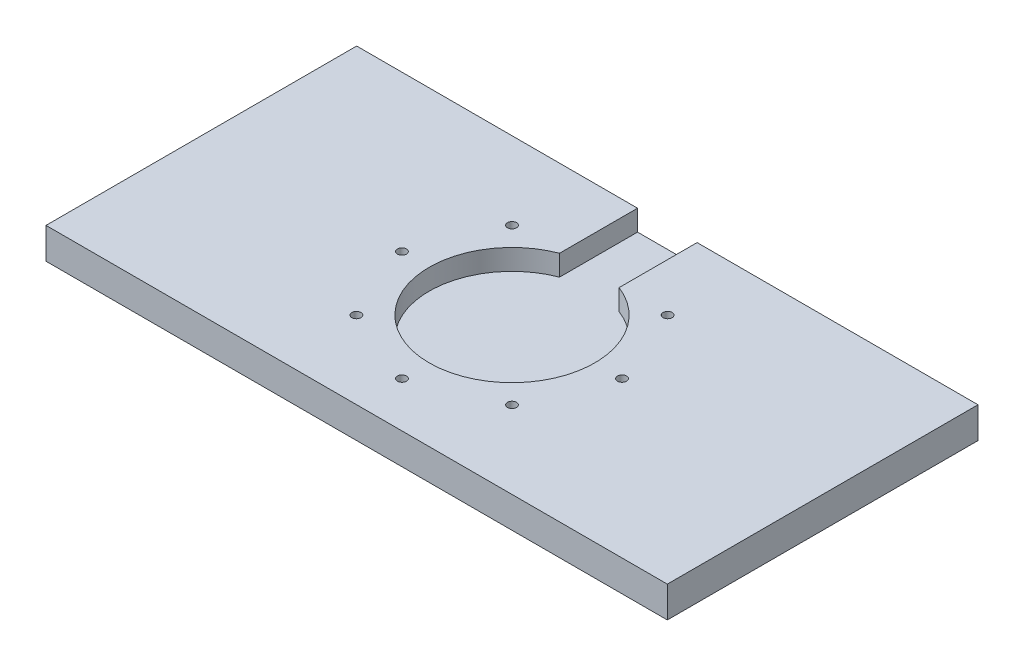
ISO-10303-21;
HEADER;
FILE_DESCRIPTION(('STEP AP214'),'2;1');
FILE_NAME('part.step','',(''),(''),'','','');
FILE_SCHEMA(('AUTOMOTIVE_DESIGN { 1 0 10303 214 1 1 1 1 }'));
ENDSEC;
DATA;
#1=APPLICATION_CONTEXT('core data for automotive mechanical design processes');
#2=APPLICATION_PROTOCOL_DEFINITION('international standard','automotive_design',2000,#1);
#3=PRODUCT_CONTEXT('',#1,'mechanical');
#4=PRODUCT('Part','Part','',(#3));
#5=PRODUCT_RELATED_PRODUCT_CATEGORY('part','',(#4));
#6=PRODUCT_DEFINITION_FORMATION('','',#4);
#7=PRODUCT_DEFINITION_CONTEXT('part definition',#1,'design');
#8=PRODUCT_DEFINITION('design','',#6,#7);
#9=PRODUCT_DEFINITION_SHAPE('','',#8);
#10=(LENGTH_UNIT() NAMED_UNIT(*) SI_UNIT(.MILLI.,.METRE.));
#11=(NAMED_UNIT(*) PLANE_ANGLE_UNIT() SI_UNIT($,.RADIAN.));
#12=(NAMED_UNIT(*) SI_UNIT($,.STERADIAN.) SOLID_ANGLE_UNIT());
#13=UNCERTAINTY_MEASURE_WITH_UNIT(LENGTH_MEASURE(1.E-05),#10,'distance_accuracy_value','');
#14=(GEOMETRIC_REPRESENTATION_CONTEXT(3) GLOBAL_UNCERTAINTY_ASSIGNED_CONTEXT((#13)) GLOBAL_UNIT_ASSIGNED_CONTEXT((#10,
#11,#12)) REPRESENTATION_CONTEXT('',''));
#15=CARTESIAN_POINT('',(0.,0.,0.));
#16=DIRECTION('',(0.,0.,1.));
#17=DIRECTION('',(1.,0.,0.));
#18=AXIS2_PLACEMENT_3D('',#15,#16,#17);
#19=CARTESIAN_POINT('',(-120.,-12.,-60.));
#20=DIRECTION('',(0.,0.,1.));
#21=DIRECTION('',(1.,0.,0.));
#22=AXIS2_PLACEMENT_3D('',#19,#20,#21);
#23=PLANE('',#22);
#24=DIRECTION('',(0.,1.,0.));
#25=VECTOR('',#24,1.);
#26=CARTESIAN_POINT('',(-11.5,-8.,-60.));
#27=LINE('',#26,#25);
#28=CARTESIAN_POINT('',(-11.5,-8.,-60.));
#29=VERTEX_POINT('',#28);
#30=CARTESIAN_POINT('',(-11.5,0.,-60.));
#31=VERTEX_POINT('',#30);
#32=EDGE_CURVE('E114',#29,#31,#27,.T.);
#33=ORIENTED_EDGE('',*,*,#32,.F.);
#34=DIRECTION('',(1.,0.,0.));
#35=VECTOR('',#34,1.);
#36=CARTESIAN_POINT('',(-11.5,-8.,-60.));
#37=LINE('',#36,#35);
#38=CARTESIAN_POINT('',(11.5,-8.,-60.));
#39=VERTEX_POINT('',#38);
#40=EDGE_CURVE('E119',#29,#39,#37,.T.);
#41=ORIENTED_EDGE('',*,*,#40,.T.);
#42=DIRECTION('',(0.,1.,0.));
#43=VECTOR('',#42,1.);
#44=CARTESIAN_POINT('',(11.5,-8.,-60.));
#45=LINE('',#44,#43);
#46=CARTESIAN_POINT('',(11.5,0.,-60.));
#47=VERTEX_POINT('',#46);
#48=EDGE_CURVE('E130',#39,#47,#45,.T.);
#49=ORIENTED_EDGE('',*,*,#48,.T.);
#50=DIRECTION('',(1.,0.,0.));
#51=VECTOR('',#50,1.);
#52=CARTESIAN_POINT('',(-120.,0.,-60.));
#53=LINE('',#52,#51);
#54=CARTESIAN_POINT('',(120.,0.,-60.));
#55=VERTEX_POINT('',#54);
#56=EDGE_CURVE('E160',#47,#55,#53,.T.);
#57=ORIENTED_EDGE('',*,*,#56,.T.);
#58=DIRECTION('',(0.,1.,0.));
#59=VECTOR('',#58,1.);
#60=CARTESIAN_POINT('',(120.,-12.,-60.));
#61=LINE('',#60,#59);
#62=CARTESIAN_POINT('',(120.,-12.,-60.));
#63=VERTEX_POINT('',#62);
#64=EDGE_CURVE('E48',#63,#55,#61,.T.);
#65=ORIENTED_EDGE('',*,*,#64,.F.);
#66=DIRECTION('',(1.,0.,0.));
#67=VECTOR('',#66,1.);
#68=CARTESIAN_POINT('',(-120.,-12.,-60.));
#69=LINE('',#68,#67);
#70=CARTESIAN_POINT('',(-120.,-12.,-60.));
#71=VERTEX_POINT('',#70);
#72=EDGE_CURVE('E150',#71,#63,#69,.T.);
#73=ORIENTED_EDGE('',*,*,#72,.F.);
#74=DIRECTION('',(0.,1.,0.));
#75=VECTOR('',#74,1.);
#76=CARTESIAN_POINT('',(-120.,-12.,-60.));
#77=LINE('',#76,#75);
#78=CARTESIAN_POINT('',(-120.,0.,-60.));
#79=VERTEX_POINT('',#78);
#80=EDGE_CURVE('E11',#71,#79,#77,.T.);
#81=ORIENTED_EDGE('',*,*,#80,.T.);
#82=EDGE_CURVE('E128',#79,#31,#53,.T.);
#83=ORIENTED_EDGE('',*,*,#82,.T.);
#84=EDGE_LOOP('',(#33,#41,#49,#57,#65,#73,#81,#83));
#85=FACE_BOUND('',#84,.T.);
#86=ADVANCED_FACE('F39',(#85),#23,.F.);
#87=CARTESIAN_POINT('',(0.,0.,0.));
#88=DIRECTION('',(0.,1.,0.));
#89=DIRECTION('',(0.,0.,1.));
#90=AXIS2_PLACEMENT_3D('',#87,#88,#89);
#91=PLANE('',#90);
#92=CARTESIAN_POINT('',(-42.5,0.,0.));
#93=DIRECTION('',(0.,1.,0.));
#94=DIRECTION('',(0.,0.,1.));
#95=AXIS2_PLACEMENT_3D('',#92,#93,#94);
#96=CIRCLE('',#95,1.75);
#97=CARTESIAN_POINT('',(-42.5,0.,1.75));
#98=VERTEX_POINT('',#97);
#99=EDGE_CURVE('E203',#98,#98,#96,.T.);
#100=ORIENTED_EDGE('',*,*,#99,.F.);
#101=EDGE_LOOP('',(#100));
#102=FACE_BOUND('',#101,.T.);
#103=CARTESIAN_POINT('',(-30.0520382004286,0.,30.0520382004279));
#104=DIRECTION('',(0.,1.,0.));
#105=DIRECTION('',(0.,0.,1.));
#106=AXIS2_PLACEMENT_3D('',#103,#104,#105);
#107=CIRCLE('',#106,1.75000000000001);
#108=CARTESIAN_POINT('',(-30.0520382004286,0.,31.8020382004279));
#109=VERTEX_POINT('',#108);
#110=EDGE_CURVE('E187',#109,#109,#107,.T.);
#111=ORIENTED_EDGE('',*,*,#110,.F.);
#112=EDGE_LOOP('',(#111));
#113=FACE_BOUND('',#112,.T.);
#114=CARTESIAN_POINT('',(-4.451638707025E-13,0.,42.5));
#115=DIRECTION('',(0.,1.,0.));
#116=DIRECTION('',(0.,0.,1.));
#117=AXIS2_PLACEMENT_3D('',#114,#115,#116);
#118=CIRCLE('',#117,1.75000000000001);
#119=CARTESIAN_POINT('',(-4.451638707025E-13,0.,44.25));
#120=VERTEX_POINT('',#119);
#121=EDGE_CURVE('E191',#120,#120,#118,.T.);
#122=ORIENTED_EDGE('',*,*,#121,.F.);
#123=EDGE_LOOP('',(#122));
#124=FACE_BOUND('',#123,.T.);
#125=CARTESIAN_POINT('',(30.052038200428,0.,30.0520382004285));
#126=DIRECTION('',(0.,1.,0.));
#127=DIRECTION('',(0.,0.,1.));
#128=AXIS2_PLACEMENT_3D('',#125,#126,#127);
#129=CIRCLE('',#128,1.75);
#130=CARTESIAN_POINT('',(30.052038200428,0.,31.8020382004285));
#131=VERTEX_POINT('',#130);
#132=EDGE_CURVE('E196',#131,#131,#129,.T.);
#133=ORIENTED_EDGE('',*,*,#132,.F.);
#134=EDGE_LOOP('',(#133));
#135=FACE_BOUND('',#134,.T.);
#136=CARTESIAN_POINT('',(42.5,0.,2.96775913801666E-13));
#137=DIRECTION('',(0.,1.,0.));
#138=DIRECTION('',(0.,0.,1.));
#139=AXIS2_PLACEMENT_3D('',#136,#137,#138);
#140=CIRCLE('',#139,1.75000000000001);
#141=CARTESIAN_POINT('',(42.5,0.,1.7500000000003));
#142=VERTEX_POINT('',#141);
#143=EDGE_CURVE('E207',#142,#142,#140,.T.);
#144=ORIENTED_EDGE('',*,*,#143,.F.);
#145=EDGE_LOOP('',(#144));
#146=FACE_BOUND('',#145,.T.);
#147=CARTESIAN_POINT('',(30.0520382004284,0.,-30.0520382004281));
#148=DIRECTION('',(0.,1.,0.));
#149=DIRECTION('',(0.,0.,1.));
#150=AXIS2_PLACEMENT_3D('',#147,#148,#149);
#151=CIRCLE('',#150,1.75000000000001);
#152=CARTESIAN_POINT('',(30.0520382004284,0.,-28.3020382004281));
#153=VERTEX_POINT('',#152);
#154=EDGE_CURVE('E204',#153,#153,#151,.T.);
#155=ORIENTED_EDGE('',*,*,#154,.F.);
#156=EDGE_LOOP('',(#155));
#157=FACE_BOUND('',#156,.T.);
#158=CARTESIAN_POINT('',(-30.0520382004282,0.,-30.0520382004283));
#159=DIRECTION('',(0.,1.,0.));
#160=DIRECTION('',(0.,0.,1.));
#161=AXIS2_PLACEMENT_3D('',#158,#159,#160);
#162=CIRCLE('',#161,1.75000000000001);
#163=CARTESIAN_POINT('',(-30.0520382004282,0.,-28.3020382004283));
#164=VERTEX_POINT('',#163);
#165=EDGE_CURVE('E200',#164,#164,#162,.T.);
#166=ORIENTED_EDGE('',*,*,#165,.F.);
#167=EDGE_LOOP('',(#166));
#168=FACE_BOUND('',#167,.T.);
#169=CARTESIAN_POINT('',(0.,0.,0.));
#170=DIRECTION('',(0.,1.,0.));
#171=DIRECTION('',(0.,0.,1.));
#172=AXIS2_PLACEMENT_3D('',#169,#170,#171);
#173=CIRCLE('',#172,32.);
#174=CARTESIAN_POINT('',(-11.5,0.,-29.8621834432782));
#175=VERTEX_POINT('',#174);
#176=CARTESIAN_POINT('',(11.5,0.,-29.8621834432782));
#177=VERTEX_POINT('',#176);
#178=EDGE_CURVE('E138',#175,#177,#173,.T.);
#179=ORIENTED_EDGE('',*,*,#178,.F.);
#180=DIRECTION('',(0.,0.,-1.));
#181=VECTOR('',#180,1.);
#182=CARTESIAN_POINT('',(-11.5,0.,-29.5336274947078));
#183=LINE('',#182,#181);
#184=EDGE_CURVE('E213',#175,#31,#183,.T.);
#185=ORIENTED_EDGE('',*,*,#184,.T.);
#186=ORIENTED_EDGE('',*,*,#82,.F.);
#187=DIRECTION('',(0.,0.,1.));
#188=VECTOR('',#187,1.);
#189=CARTESIAN_POINT('',(-120.,0.,-60.));
#190=LINE('',#189,#188);
#191=CARTESIAN_POINT('',(-120.,0.,60.));
#192=VERTEX_POINT('',#191);
#193=EDGE_CURVE('E141',#79,#192,#190,.T.);
#194=ORIENTED_EDGE('',*,*,#193,.T.);
#195=DIRECTION('',(1.,0.,0.));
#196=VECTOR('',#195,1.);
#197=CARTESIAN_POINT('',(-120.,0.,60.));
#198=LINE('',#197,#196);
#199=CARTESIAN_POINT('',(120.,0.,60.));
#200=VERTEX_POINT('',#199);
#201=EDGE_CURVE('E154',#192,#200,#198,.T.);
#202=ORIENTED_EDGE('',*,*,#201,.T.);
#203=DIRECTION('',(0.,0.,1.));
#204=VECTOR('',#203,1.);
#205=CARTESIAN_POINT('',(120.,0.,-60.));
#206=LINE('',#205,#204);
#207=EDGE_CURVE('E157',#55,#200,#206,.T.);
#208=ORIENTED_EDGE('',*,*,#207,.F.);
#209=ORIENTED_EDGE('',*,*,#56,.F.);
#210=DIRECTION('',(0.,0.,-1.));
#211=VECTOR('',#210,1.);
#212=CARTESIAN_POINT('',(11.5,0.,-29.5336274947078));
#213=LINE('',#212,#211);
#214=EDGE_CURVE('E120',#177,#47,#213,.T.);
#215=ORIENTED_EDGE('',*,*,#214,.F.);
#216=EDGE_LOOP('',(#179,#185,#186,#194,#202,#208,#209,#215));
#217=FACE_BOUND('',#216,.T.);
#218=ADVANCED_FACE('F222',(#102,#113,#124,#135,#146,#157,#168,#217),#91,.T.);
#219=CARTESIAN_POINT('',(0.,-8.,0.));
#220=DIRECTION('',(0.,1.,0.));
#221=DIRECTION('',(0.,0.,1.));
#222=AXIS2_PLACEMENT_3D('',#219,#220,#221);
#223=CYLINDRICAL_SURFACE('',#222,32.);
#224=DIRECTION('',(0.,1.,0.));
#225=VECTOR('',#224,1.);
#226=CARTESIAN_POINT('',(-11.5,-8.,-29.8621834432782));
#227=LINE('',#226,#225);
#228=CARTESIAN_POINT('',(-11.5,-8.,-29.8621834432782));
#229=VERTEX_POINT('',#228);
#230=EDGE_CURVE('E117',#175,#229,#227,.F.);
#231=ORIENTED_EDGE('',*,*,#230,.F.);
#232=ORIENTED_EDGE('',*,*,#178,.T.);
#233=DIRECTION('',(0.,1.,0.));
#234=VECTOR('',#233,1.);
#235=CARTESIAN_POINT('',(11.5,-8.,-29.8621834432782));
#236=LINE('',#235,#234);
#237=CARTESIAN_POINT('',(11.5,-8.,-29.8621834432782));
#238=VERTEX_POINT('',#237);
#239=EDGE_CURVE('E129',#177,#238,#236,.F.);
#240=ORIENTED_EDGE('',*,*,#239,.T.);
#241=CARTESIAN_POINT('',(0.,-8.,0.));
#242=DIRECTION('',(0.,1.,0.));
#243=DIRECTION('',(0.,0.,1.));
#244=AXIS2_PLACEMENT_3D('',#241,#242,#243);
#245=CIRCLE('',#244,32.);
#246=EDGE_CURVE('E139',#229,#238,#245,.T.);
#247=ORIENTED_EDGE('',*,*,#246,.F.);
#248=EDGE_LOOP('',(#231,#232,#240,#247));
#249=FACE_BOUND('',#248,.T.);
#250=ADVANCED_FACE('F232',(#249),#223,.F.);
#251=CARTESIAN_POINT('',(-120.,-12.,-60.));
#252=DIRECTION('',(-1.,0.,0.));
#253=DIRECTION('',(0.,0.,1.));
#254=AXIS2_PLACEMENT_3D('',#251,#252,#253);
#255=PLANE('',#254);
#256=ORIENTED_EDGE('',*,*,#193,.F.);
#257=ORIENTED_EDGE('',*,*,#80,.F.);
#258=DIRECTION('',(0.,0.,1.));
#259=VECTOR('',#258,1.);
#260=CARTESIAN_POINT('',(-120.,-12.,-60.));
#261=LINE('',#260,#259);
#262=CARTESIAN_POINT('',(-120.,-12.,60.));
#263=VERTEX_POINT('',#262);
#264=EDGE_CURVE('E144',#71,#263,#261,.T.);
#265=ORIENTED_EDGE('',*,*,#264,.T.);
#266=DIRECTION('',(0.,1.,0.));
#267=VECTOR('',#266,1.);
#268=CARTESIAN_POINT('',(-120.,-12.,60.));
#269=LINE('',#268,#267);
#270=EDGE_CURVE('E89',#263,#192,#269,.T.);
#271=ORIENTED_EDGE('',*,*,#270,.T.);
#272=EDGE_LOOP('',(#256,#257,#265,#271));
#273=FACE_BOUND('',#272,.T.);
#274=ADVANCED_FACE('F41',(#273),#255,.T.);
#275=CARTESIAN_POINT('',(120.,-12.,-60.));
#276=DIRECTION('',(-1.,0.,0.));
#277=DIRECTION('',(0.,0.,1.));
#278=AXIS2_PLACEMENT_3D('',#275,#276,#277);
#279=PLANE('',#278);
#280=ORIENTED_EDGE('',*,*,#207,.T.);
#281=DIRECTION('',(0.,1.,0.));
#282=VECTOR('',#281,1.);
#283=CARTESIAN_POINT('',(120.,-12.,60.));
#284=LINE('',#283,#282);
#285=CARTESIAN_POINT('',(120.,-12.,60.));
#286=VERTEX_POINT('',#285);
#287=EDGE_CURVE('E164',#286,#200,#284,.T.);
#288=ORIENTED_EDGE('',*,*,#287,.F.);
#289=DIRECTION('',(0.,0.,1.));
#290=VECTOR('',#289,1.);
#291=CARTESIAN_POINT('',(120.,-12.,-60.));
#292=LINE('',#291,#290);
#293=EDGE_CURVE('E148',#63,#286,#292,.T.);
#294=ORIENTED_EDGE('',*,*,#293,.F.);
#295=ORIENTED_EDGE('',*,*,#64,.T.);
#296=EDGE_LOOP('',(#280,#288,#294,#295));
#297=FACE_BOUND('',#296,.T.);
#298=ADVANCED_FACE('F225',(#297),#279,.F.);
#299=CARTESIAN_POINT('',(-120.,-12.,60.));
#300=DIRECTION('',(0.,0.,1.));
#301=DIRECTION('',(1.,0.,0.));
#302=AXIS2_PLACEMENT_3D('',#299,#300,#301);
#303=PLANE('',#302);
#304=ORIENTED_EDGE('',*,*,#201,.F.);
#305=ORIENTED_EDGE('',*,*,#270,.F.);
#306=DIRECTION('',(1.,0.,0.));
#307=VECTOR('',#306,1.);
#308=CARTESIAN_POINT('',(-120.,-12.,60.));
#309=LINE('',#308,#307);
#310=EDGE_CURVE('E146',#263,#286,#309,.T.);
#311=ORIENTED_EDGE('',*,*,#310,.T.);
#312=ORIENTED_EDGE('',*,*,#287,.T.);
#313=EDGE_LOOP('',(#304,#305,#311,#312));
#314=FACE_BOUND('',#313,.T.);
#315=ADVANCED_FACE('F230',(#314),#303,.T.);
#316=CARTESIAN_POINT('',(0.,-12.,0.));
#317=DIRECTION('',(0.,1.,0.));
#318=DIRECTION('',(0.,0.,1.));
#319=AXIS2_PLACEMENT_3D('',#316,#317,#318);
#320=PLANE('',#319);
#321=CARTESIAN_POINT('',(-42.5,-12.,0.));
#322=DIRECTION('',(0.,1.,0.));
#323=DIRECTION('',(0.,0.,1.));
#324=AXIS2_PLACEMENT_3D('',#321,#322,#323);
#325=CIRCLE('',#324,3.);
#326=CARTESIAN_POINT('',(-42.5,-12.,3.));
#327=VERTEX_POINT('',#326);
#328=EDGE_CURVE('E261',#327,#327,#325,.T.);
#329=ORIENTED_EDGE('',*,*,#328,.T.);
#330=EDGE_LOOP('',(#329));
#331=FACE_BOUND('',#330,.T.);
#332=CARTESIAN_POINT('',(-30.0520382004286,-12.,30.0520382004279));
#333=DIRECTION('',(0.,1.,0.));
#334=DIRECTION('',(0.,0.,1.));
#335=AXIS2_PLACEMENT_3D('',#332,#333,#334);
#336=CIRCLE('',#335,3.);
#337=CARTESIAN_POINT('',(-30.0520382004286,-12.,33.0520382004279));
#338=VERTEX_POINT('',#337);
#339=EDGE_CURVE('E265',#338,#338,#336,.T.);
#340=ORIENTED_EDGE('',*,*,#339,.T.);
#341=EDGE_LOOP('',(#340));
#342=FACE_BOUND('',#341,.T.);
#343=CARTESIAN_POINT('',(-4.451638707025E-13,-12.,42.5));
#344=DIRECTION('',(0.,1.,0.));
#345=DIRECTION('',(0.,0.,1.));
#346=AXIS2_PLACEMENT_3D('',#343,#344,#345);
#347=CIRCLE('',#346,3.);
#348=CARTESIAN_POINT('',(-4.451638707025E-13,-12.,45.5));
#349=VERTEX_POINT('',#348);
#350=EDGE_CURVE('E269',#349,#349,#347,.T.);
#351=ORIENTED_EDGE('',*,*,#350,.T.);
#352=EDGE_LOOP('',(#351));
#353=FACE_BOUND('',#352,.T.);
#354=CARTESIAN_POINT('',(30.052038200428,-12.,30.0520382004285));
#355=DIRECTION('',(0.,1.,0.));
#356=DIRECTION('',(0.,0.,1.));
#357=AXIS2_PLACEMENT_3D('',#354,#355,#356);
#358=CIRCLE('',#357,3.00000000000001);
#359=CARTESIAN_POINT('',(30.052038200428,-12.,33.0520382004285));
#360=VERTEX_POINT('',#359);
#361=EDGE_CURVE('E273',#360,#360,#358,.T.);
#362=ORIENTED_EDGE('',*,*,#361,.T.);
#363=EDGE_LOOP('',(#362));
#364=FACE_BOUND('',#363,.T.);
#365=CARTESIAN_POINT('',(42.5,-12.,2.96775913801666E-13));
#366=DIRECTION('',(0.,1.,0.));
#367=DIRECTION('',(0.,0.,1.));
#368=AXIS2_PLACEMENT_3D('',#365,#366,#367);
#369=CIRCLE('',#368,3.);
#370=CARTESIAN_POINT('',(42.5,-12.,3.0000000000003));
#371=VERTEX_POINT('',#370);
#372=EDGE_CURVE('E277',#371,#371,#369,.T.);
#373=ORIENTED_EDGE('',*,*,#372,.T.);
#374=EDGE_LOOP('',(#373));
#375=FACE_BOUND('',#374,.T.);
#376=CARTESIAN_POINT('',(30.0520382004284,-12.,-30.0520382004281));
#377=DIRECTION('',(0.,1.,0.));
#378=DIRECTION('',(0.,0.,1.));
#379=AXIS2_PLACEMENT_3D('',#376,#377,#378);
#380=CIRCLE('',#379,3.);
#381=CARTESIAN_POINT('',(30.0520382004284,-12.,-27.0520382004281));
#382=VERTEX_POINT('',#381);
#383=EDGE_CURVE('E281',#382,#382,#380,.T.);
#384=ORIENTED_EDGE('',*,*,#383,.T.);
#385=EDGE_LOOP('',(#384));
#386=FACE_BOUND('',#385,.T.);
#387=CARTESIAN_POINT('',(-30.0520382004282,-12.,-30.0520382004283));
#388=DIRECTION('',(0.,1.,0.));
#389=DIRECTION('',(0.,0.,1.));
#390=AXIS2_PLACEMENT_3D('',#387,#388,#389);
#391=CIRCLE('',#390,3.);
#392=CARTESIAN_POINT('',(-30.0520382004282,-12.,-27.0520382004283));
#393=VERTEX_POINT('',#392);
#394=EDGE_CURVE('E284',#393,#393,#391,.T.);
#395=ORIENTED_EDGE('',*,*,#394,.T.);
#396=EDGE_LOOP('',(#395));
#397=FACE_BOUND('',#396,.T.);
#398=ORIENTED_EDGE('',*,*,#264,.F.);
#399=ORIENTED_EDGE('',*,*,#72,.T.);
#400=ORIENTED_EDGE('',*,*,#293,.T.);
#401=ORIENTED_EDGE('',*,*,#310,.F.);
#402=EDGE_LOOP('',(#398,#399,#400,#401));
#403=FACE_BOUND('',#402,.T.);
#404=ADVANCED_FACE('F229',(#331,#342,#353,#364,#375,#386,#397,#403),#320,.F.);
#405=CARTESIAN_POINT('',(0.,-8.,0.));
#406=DIRECTION('',(0.,1.,0.));
#407=DIRECTION('',(0.,0.,1.));
#408=AXIS2_PLACEMENT_3D('',#405,#406,#407);
#409=PLANE('',#408);
#410=ORIENTED_EDGE('',*,*,#246,.T.);
#411=DIRECTION('',(0.,0.,-1.));
#412=VECTOR('',#411,1.);
#413=CARTESIAN_POINT('',(11.5,-8.,-29.5336274947078));
#414=LINE('',#413,#412);
#415=EDGE_CURVE('E124',#238,#39,#414,.T.);
#416=ORIENTED_EDGE('',*,*,#415,.T.);
#417=ORIENTED_EDGE('',*,*,#40,.F.);
#418=DIRECTION('',(0.,0.,-1.));
#419=VECTOR('',#418,1.);
#420=CARTESIAN_POINT('',(-11.5,-8.,-29.5336274947078));
#421=LINE('',#420,#419);
#422=EDGE_CURVE('E56',#229,#29,#421,.T.);
#423=ORIENTED_EDGE('',*,*,#422,.F.);
#424=EDGE_LOOP('',(#410,#416,#417,#423));
#425=FACE_BOUND('',#424,.T.);
#426=ADVANCED_FACE('F123',(#425),#409,.T.);
#427=CARTESIAN_POINT('',(-11.5,-8.,-29.5336274947078));
#428=DIRECTION('',(1.,0.,0.));
#429=DIRECTION('',(0.,0.,-1.));
#430=AXIS2_PLACEMENT_3D('',#427,#428,#429);
#431=PLANE('',#430);
#432=ORIENTED_EDGE('',*,*,#230,.T.);
#433=ORIENTED_EDGE('',*,*,#422,.T.);
#434=ORIENTED_EDGE('',*,*,#32,.T.);
#435=ORIENTED_EDGE('',*,*,#184,.F.);
#436=EDGE_LOOP('',(#432,#433,#434,#435));
#437=FACE_BOUND('',#436,.T.);
#438=ADVANCED_FACE('F112',(#437),#431,.T.);
#439=CARTESIAN_POINT('',(11.5,-8.,-29.5336274947078));
#440=DIRECTION('',(1.,0.,0.));
#441=DIRECTION('',(0.,0.,-1.));
#442=AXIS2_PLACEMENT_3D('',#439,#440,#441);
#443=PLANE('',#442);
#444=ORIENTED_EDGE('',*,*,#214,.T.);
#445=ORIENTED_EDGE('',*,*,#48,.F.);
#446=ORIENTED_EDGE('',*,*,#415,.F.);
#447=ORIENTED_EDGE('',*,*,#239,.F.);
#448=EDGE_LOOP('',(#444,#445,#446,#447));
#449=FACE_BOUND('',#448,.T.);
#450=ADVANCED_FACE('F216',(#449),#443,.F.);
#451=CARTESIAN_POINT('',(-30.0520382004282,-20.,-30.0520382004283));
#452=DIRECTION('',(0.,1.,0.));
#453=DIRECTION('',(0.,0.,1.));
#454=AXIS2_PLACEMENT_3D('',#451,#452,#453);
#455=CYLINDRICAL_SURFACE('',#454,1.75000000000001);
#456=CARTESIAN_POINT('',(-30.0520382004282,-7.,-30.0520382004283));
#457=DIRECTION('',(0.,1.,0.));
#458=DIRECTION('',(0.,0.,1.));
#459=AXIS2_PLACEMENT_3D('',#456,#457,#458);
#460=CIRCLE('',#459,1.75000000000001);
#461=CARTESIAN_POINT('',(-30.0520382004282,-7.,-28.3020382004283));
#462=VERTEX_POINT('',#461);
#463=EDGE_CURVE('E43',#462,#462,#460,.F.);
#464=ORIENTED_EDGE('',*,*,#463,.T.);
#465=EDGE_LOOP('',(#464));
#466=FACE_BOUND('',#465,.T.);
#467=ORIENTED_EDGE('',*,*,#165,.T.);
#468=EDGE_LOOP('',(#467));
#469=FACE_BOUND('',#468,.T.);
#470=ADVANCED_FACE('F322',(#466,#469),#455,.F.);
#471=CARTESIAN_POINT('',(30.0520382004284,-20.,-30.0520382004281));
#472=DIRECTION('',(0.,1.,0.));
#473=DIRECTION('',(0.,0.,1.));
#474=AXIS2_PLACEMENT_3D('',#471,#472,#473);
#475=CYLINDRICAL_SURFACE('',#474,1.75000000000001);
#476=CARTESIAN_POINT('',(30.0520382004284,-7.,-30.0520382004281));
#477=DIRECTION('',(0.,1.,0.));
#478=DIRECTION('',(0.,0.,1.));
#479=AXIS2_PLACEMENT_3D('',#476,#477,#478);
#480=CIRCLE('',#479,1.75000000000001);
#481=CARTESIAN_POINT('',(30.0520382004284,-7.,-28.3020382004281));
#482=VERTEX_POINT('',#481);
#483=EDGE_CURVE('E182',#482,#482,#480,.F.);
#484=ORIENTED_EDGE('',*,*,#483,.T.);
#485=EDGE_LOOP('',(#484));
#486=FACE_BOUND('',#485,.T.);
#487=ORIENTED_EDGE('',*,*,#154,.T.);
#488=EDGE_LOOP('',(#487));
#489=FACE_BOUND('',#488,.T.);
#490=ADVANCED_FACE('F323',(#486,#489),#475,.F.);
#491=CARTESIAN_POINT('',(42.5,-20.,2.96775913801666E-13));
#492=DIRECTION('',(0.,1.,0.));
#493=DIRECTION('',(0.,0.,1.));
#494=AXIS2_PLACEMENT_3D('',#491,#492,#493);
#495=CYLINDRICAL_SURFACE('',#494,1.75000000000001);
#496=CARTESIAN_POINT('',(42.5,-7.,2.96775913801666E-13));
#497=DIRECTION('',(0.,1.,0.));
#498=DIRECTION('',(0.,0.,1.));
#499=AXIS2_PLACEMENT_3D('',#496,#497,#498);
#500=CIRCLE('',#499,1.75000000000001);
#501=CARTESIAN_POINT('',(42.5,-7.,1.7500000000003));
#502=VERTEX_POINT('',#501);
#503=EDGE_CURVE('E180',#502,#502,#500,.F.);
#504=ORIENTED_EDGE('',*,*,#503,.T.);
#505=EDGE_LOOP('',(#504));
#506=FACE_BOUND('',#505,.T.);
#507=ORIENTED_EDGE('',*,*,#143,.T.);
#508=EDGE_LOOP('',(#507));
#509=FACE_BOUND('',#508,.T.);
#510=ADVANCED_FACE('F328',(#506,#509),#495,.F.);
#511=CARTESIAN_POINT('',(30.052038200428,-20.,30.0520382004285));
#512=DIRECTION('',(0.,1.,0.));
#513=DIRECTION('',(0.,0.,1.));
#514=AXIS2_PLACEMENT_3D('',#511,#512,#513);
#515=CYLINDRICAL_SURFACE('',#514,1.75);
#516=CARTESIAN_POINT('',(30.052038200428,-7.,30.0520382004285));
#517=DIRECTION('',(0.,1.,0.));
#518=DIRECTION('',(0.,0.,1.));
#519=AXIS2_PLACEMENT_3D('',#516,#517,#518);
#520=CIRCLE('',#519,1.75);
#521=CARTESIAN_POINT('',(30.052038200428,-7.,31.8020382004285));
#522=VERTEX_POINT('',#521);
#523=EDGE_CURVE('E177',#522,#522,#520,.F.);
#524=ORIENTED_EDGE('',*,*,#523,.T.);
#525=EDGE_LOOP('',(#524));
#526=FACE_BOUND('',#525,.T.);
#527=ORIENTED_EDGE('',*,*,#132,.T.);
#528=EDGE_LOOP('',(#527));
#529=FACE_BOUND('',#528,.T.);
#530=ADVANCED_FACE('F338',(#526,#529),#515,.F.);
#531=CARTESIAN_POINT('',(-4.451638707025E-13,-20.,42.5));
#532=DIRECTION('',(0.,1.,0.));
#533=DIRECTION('',(0.,0.,1.));
#534=AXIS2_PLACEMENT_3D('',#531,#532,#533);
#535=CYLINDRICAL_SURFACE('',#534,1.75000000000001);
#536=CARTESIAN_POINT('',(-4.451638707025E-13,-7.,42.5));
#537=DIRECTION('',(0.,1.,0.));
#538=DIRECTION('',(0.,0.,1.));
#539=AXIS2_PLACEMENT_3D('',#536,#537,#538);
#540=CIRCLE('',#539,1.75000000000001);
#541=CARTESIAN_POINT('',(-4.451638707025E-13,-7.,44.25));
#542=VERTEX_POINT('',#541);
#543=EDGE_CURVE('E174',#542,#542,#540,.F.);
#544=ORIENTED_EDGE('',*,*,#543,.T.);
#545=EDGE_LOOP('',(#544));
#546=FACE_BOUND('',#545,.T.);
#547=ORIENTED_EDGE('',*,*,#121,.T.);
#548=EDGE_LOOP('',(#547));
#549=FACE_BOUND('',#548,.T.);
#550=ADVANCED_FACE('F341',(#546,#549),#535,.F.);
#551=CARTESIAN_POINT('',(-30.0520382004286,-20.,30.0520382004279));
#552=DIRECTION('',(0.,1.,0.));
#553=DIRECTION('',(0.,0.,1.));
#554=AXIS2_PLACEMENT_3D('',#551,#552,#553);
#555=CYLINDRICAL_SURFACE('',#554,1.75000000000001);
#556=CARTESIAN_POINT('',(-30.0520382004286,-7.,30.0520382004279));
#557=DIRECTION('',(0.,1.,0.));
#558=DIRECTION('',(0.,0.,1.));
#559=AXIS2_PLACEMENT_3D('',#556,#557,#558);
#560=CIRCLE('',#559,1.75000000000001);
#561=CARTESIAN_POINT('',(-30.0520382004286,-7.,31.8020382004279));
#562=VERTEX_POINT('',#561);
#563=EDGE_CURVE('E170',#562,#562,#560,.F.);
#564=ORIENTED_EDGE('',*,*,#563,.T.);
#565=EDGE_LOOP('',(#564));
#566=FACE_BOUND('',#565,.T.);
#567=ORIENTED_EDGE('',*,*,#110,.T.);
#568=EDGE_LOOP('',(#567));
#569=FACE_BOUND('',#568,.T.);
#570=ADVANCED_FACE('F333',(#566,#569),#555,.F.);
#571=CARTESIAN_POINT('',(-42.5,-20.,0.));
#572=DIRECTION('',(0.,1.,0.));
#573=DIRECTION('',(0.,0.,1.));
#574=AXIS2_PLACEMENT_3D('',#571,#572,#573);
#575=CYLINDRICAL_SURFACE('',#574,1.75);
#576=CARTESIAN_POINT('',(-42.5,-7.,0.));
#577=DIRECTION('',(0.,1.,0.));
#578=DIRECTION('',(0.,0.,1.));
#579=AXIS2_PLACEMENT_3D('',#576,#577,#578);
#580=CIRCLE('',#579,1.75);
#581=CARTESIAN_POINT('',(-42.5,-7.,1.75));
#582=VERTEX_POINT('',#581);
#583=EDGE_CURVE('E167',#582,#582,#580,.F.);
#584=ORIENTED_EDGE('',*,*,#583,.T.);
#585=EDGE_LOOP('',(#584));
#586=FACE_BOUND('',#585,.T.);
#587=ORIENTED_EDGE('',*,*,#99,.T.);
#588=EDGE_LOOP('',(#587));
#589=FACE_BOUND('',#588,.T.);
#590=ADVANCED_FACE('F309',(#586,#589),#575,.F.);
#591=CARTESIAN_POINT('',(-42.5,-7.,0.));
#592=DIRECTION('',(0.,1.,0.));
#593=DIRECTION('',(0.,0.,1.));
#594=AXIS2_PLACEMENT_3D('',#591,#592,#593);
#595=PLANE('',#594);
#596=CARTESIAN_POINT('',(-42.5,-7.,0.));
#597=DIRECTION('',(0.,1.,0.));
#598=DIRECTION('',(0.,0.,1.));
#599=AXIS2_PLACEMENT_3D('',#596,#597,#598);
#600=CIRCLE('',#599,3.);
#601=CARTESIAN_POINT('',(-42.5,-7.,3.));
#602=VERTEX_POINT('',#601);
#603=EDGE_CURVE('E171',#602,#602,#600,.T.);
#604=ORIENTED_EDGE('',*,*,#603,.F.);
#605=EDGE_LOOP('',(#604));
#606=FACE_BOUND('',#605,.T.);
#607=ORIENTED_EDGE('',*,*,#583,.F.);
#608=EDGE_LOOP('',(#607));
#609=FACE_BOUND('',#608,.T.);
#610=ADVANCED_FACE('F410',(#606,#609),#595,.F.);
#611=CARTESIAN_POINT('',(-42.5,-7.,0.));
#612=DIRECTION('',(0.,-1.,0.));
#613=DIRECTION('',(0.,0.,-1.));
#614=AXIS2_PLACEMENT_3D('',#611,#612,#613);
#615=CYLINDRICAL_SURFACE('',#614,3.);
#616=ORIENTED_EDGE('',*,*,#603,.T.);
#617=EDGE_LOOP('',(#616));
#618=FACE_BOUND('',#617,.T.);
#619=ORIENTED_EDGE('',*,*,#328,.F.);
#620=EDGE_LOOP('',(#619));
#621=FACE_BOUND('',#620,.T.);
#622=ADVANCED_FACE('F419',(#618,#621),#615,.F.);
#623=CARTESIAN_POINT('',(-30.0520382004286,-7.,30.0520382004279));
#624=DIRECTION('',(0.,1.,0.));
#625=DIRECTION('',(0.,0.,1.));
#626=AXIS2_PLACEMENT_3D('',#623,#624,#625);
#627=PLANE('',#626);
#628=CARTESIAN_POINT('',(-30.0520382004286,-7.,30.0520382004279));
#629=DIRECTION('',(0.,1.,0.));
#630=DIRECTION('',(0.,0.,1.));
#631=AXIS2_PLACEMENT_3D('',#628,#629,#630);
#632=CIRCLE('',#631,3.);
#633=CARTESIAN_POINT('',(-30.0520382004286,-7.,33.0520382004279));
#634=VERTEX_POINT('',#633);
#635=EDGE_CURVE('E292',#634,#634,#632,.T.);
#636=ORIENTED_EDGE('',*,*,#635,.F.);
#637=EDGE_LOOP('',(#636));
#638=FACE_BOUND('',#637,.T.);
#639=ORIENTED_EDGE('',*,*,#563,.F.);
#640=EDGE_LOOP('',(#639));
#641=FACE_BOUND('',#640,.T.);
#642=ADVANCED_FACE('F428',(#638,#641),#627,.F.);
#643=CARTESIAN_POINT('',(-30.0520382004286,-7.,30.0520382004279));
#644=DIRECTION('',(0.,-1.,0.));
#645=DIRECTION('',(0.,0.,-1.));
#646=AXIS2_PLACEMENT_3D('',#643,#644,#645);
#647=CYLINDRICAL_SURFACE('',#646,3.);
#648=ORIENTED_EDGE('',*,*,#635,.T.);
#649=EDGE_LOOP('',(#648));
#650=FACE_BOUND('',#649,.T.);
#651=ORIENTED_EDGE('',*,*,#339,.F.);
#652=EDGE_LOOP('',(#651));
#653=FACE_BOUND('',#652,.T.);
#654=ADVANCED_FACE('F437',(#650,#653),#647,.F.);
#655=CARTESIAN_POINT('',(-4.451638707025E-13,-7.,42.5));
#656=DIRECTION('',(0.,1.,0.));
#657=DIRECTION('',(0.,0.,1.));
#658=AXIS2_PLACEMENT_3D('',#655,#656,#657);
#659=PLANE('',#658);
#660=CARTESIAN_POINT('',(-4.451638707025E-13,-7.,42.5));
#661=DIRECTION('',(0.,1.,0.));
#662=DIRECTION('',(0.,0.,1.));
#663=AXIS2_PLACEMENT_3D('',#660,#661,#662);
#664=CIRCLE('',#663,3.);
#665=CARTESIAN_POINT('',(-4.451638707025E-13,-7.,45.5));
#666=VERTEX_POINT('',#665);
#667=EDGE_CURVE('E577',#666,#666,#664,.T.);
#668=ORIENTED_EDGE('',*,*,#667,.F.);
#669=EDGE_LOOP('',(#668));
#670=FACE_BOUND('',#669,.T.);
#671=ORIENTED_EDGE('',*,*,#543,.F.);
#672=EDGE_LOOP('',(#671));
#673=FACE_BOUND('',#672,.T.);
#674=ADVANCED_FACE('F446',(#670,#673),#659,.F.);
#675=CARTESIAN_POINT('',(-4.451638707025E-13,-7.,42.5));
#676=DIRECTION('',(0.,-1.,0.));
#677=DIRECTION('',(0.,0.,-1.));
#678=AXIS2_PLACEMENT_3D('',#675,#676,#677);
#679=CYLINDRICAL_SURFACE('',#678,3.);
#680=ORIENTED_EDGE('',*,*,#667,.T.);
#681=EDGE_LOOP('',(#680));
#682=FACE_BOUND('',#681,.T.);
#683=ORIENTED_EDGE('',*,*,#350,.F.);
#684=EDGE_LOOP('',(#683));
#685=FACE_BOUND('',#684,.T.);
#686=ADVANCED_FACE('F455',(#682,#685),#679,.F.);
#687=CARTESIAN_POINT('',(30.052038200428,-7.,30.0520382004285));
#688=DIRECTION('',(0.,1.,0.));
#689=DIRECTION('',(0.,0.,1.));
#690=AXIS2_PLACEMENT_3D('',#687,#688,#689);
#691=PLANE('',#690);
#692=CARTESIAN_POINT('',(30.052038200428,-7.,30.0520382004285));
#693=DIRECTION('',(0.,1.,0.));
#694=DIRECTION('',(0.,0.,1.));
#695=AXIS2_PLACEMENT_3D('',#692,#693,#694);
#696=CIRCLE('',#695,3.00000000000001);
#697=CARTESIAN_POINT('',(30.052038200428,-7.,33.0520382004285));
#698=VERTEX_POINT('',#697);
#699=EDGE_CURVE('E304',#698,#698,#696,.T.);
#700=ORIENTED_EDGE('',*,*,#699,.F.);
#701=EDGE_LOOP('',(#700));
#702=FACE_BOUND('',#701,.T.);
#703=ORIENTED_EDGE('',*,*,#523,.F.);
#704=EDGE_LOOP('',(#703));
#705=FACE_BOUND('',#704,.T.);
#706=ADVANCED_FACE('F464',(#702,#705),#691,.F.);
#707=CARTESIAN_POINT('',(30.052038200428,-7.,30.0520382004285));
#708=DIRECTION('',(0.,-1.,0.));
#709=DIRECTION('',(0.,0.,-1.));
#710=AXIS2_PLACEMENT_3D('',#707,#708,#709);
#711=CYLINDRICAL_SURFACE('',#710,3.00000000000001);
#712=ORIENTED_EDGE('',*,*,#699,.T.);
#713=EDGE_LOOP('',(#712));
#714=FACE_BOUND('',#713,.T.);
#715=ORIENTED_EDGE('',*,*,#361,.F.);
#716=EDGE_LOOP('',(#715));
#717=FACE_BOUND('',#716,.T.);
#718=ADVANCED_FACE('F473',(#714,#717),#711,.F.);
#719=CARTESIAN_POINT('',(42.5,-7.,2.96775913801666E-13));
#720=DIRECTION('',(0.,1.,0.));
#721=DIRECTION('',(0.,0.,1.));
#722=AXIS2_PLACEMENT_3D('',#719,#720,#721);
#723=PLANE('',#722);
#724=CARTESIAN_POINT('',(42.5,-7.,2.96775913801666E-13));
#725=DIRECTION('',(0.,1.,0.));
#726=DIRECTION('',(0.,0.,1.));
#727=AXIS2_PLACEMENT_3D('',#724,#725,#726);
#728=CIRCLE('',#727,3.);
#729=CARTESIAN_POINT('',(42.5,-7.,3.0000000000003));
#730=VERTEX_POINT('',#729);
#731=EDGE_CURVE('E300',#730,#730,#728,.T.);
#732=ORIENTED_EDGE('',*,*,#731,.F.);
#733=EDGE_LOOP('',(#732));
#734=FACE_BOUND('',#733,.T.);
#735=ORIENTED_EDGE('',*,*,#503,.F.);
#736=EDGE_LOOP('',(#735));
#737=FACE_BOUND('',#736,.T.);
#738=ADVANCED_FACE('F482',(#734,#737),#723,.F.);
#739=CARTESIAN_POINT('',(42.5,-7.,2.96775913801666E-13));
#740=DIRECTION('',(0.,-1.,0.));
#741=DIRECTION('',(0.,0.,-1.));
#742=AXIS2_PLACEMENT_3D('',#739,#740,#741);
#743=CYLINDRICAL_SURFACE('',#742,3.);
#744=ORIENTED_EDGE('',*,*,#731,.T.);
#745=EDGE_LOOP('',(#744));
#746=FACE_BOUND('',#745,.T.);
#747=ORIENTED_EDGE('',*,*,#372,.F.);
#748=EDGE_LOOP('',(#747));
#749=FACE_BOUND('',#748,.T.);
#750=ADVANCED_FACE('F491',(#746,#749),#743,.F.);
#751=CARTESIAN_POINT('',(30.0520382004284,-7.,-30.0520382004281));
#752=DIRECTION('',(0.,1.,0.));
#753=DIRECTION('',(0.,0.,1.));
#754=AXIS2_PLACEMENT_3D('',#751,#752,#753);
#755=PLANE('',#754);
#756=CARTESIAN_POINT('',(30.0520382004284,-7.,-30.0520382004281));
#757=DIRECTION('',(0.,1.,0.));
#758=DIRECTION('',(0.,0.,1.));
#759=AXIS2_PLACEMENT_3D('',#756,#757,#758);
#760=CIRCLE('',#759,3.);
#761=CARTESIAN_POINT('',(30.0520382004284,-7.,-27.0520382004281));
#762=VERTEX_POINT('',#761);
#763=EDGE_CURVE('E296',#762,#762,#760,.T.);
#764=ORIENTED_EDGE('',*,*,#763,.F.);
#765=EDGE_LOOP('',(#764));
#766=FACE_BOUND('',#765,.T.);
#767=ORIENTED_EDGE('',*,*,#483,.F.);
#768=EDGE_LOOP('',(#767));
#769=FACE_BOUND('',#768,.T.);
#770=ADVANCED_FACE('F500',(#766,#769),#755,.F.);
#771=CARTESIAN_POINT('',(30.0520382004284,-7.,-30.0520382004281));
#772=DIRECTION('',(0.,-1.,0.));
#773=DIRECTION('',(0.,0.,-1.));
#774=AXIS2_PLACEMENT_3D('',#771,#772,#773);
#775=CYLINDRICAL_SURFACE('',#774,3.);
#776=ORIENTED_EDGE('',*,*,#763,.T.);
#777=EDGE_LOOP('',(#776));
#778=FACE_BOUND('',#777,.T.);
#779=ORIENTED_EDGE('',*,*,#383,.F.);
#780=EDGE_LOOP('',(#779));
#781=FACE_BOUND('',#780,.T.);
#782=ADVANCED_FACE('F509',(#778,#781),#775,.F.);
#783=CARTESIAN_POINT('',(-30.0520382004282,-7.,-30.0520382004283));
#784=DIRECTION('',(0.,1.,0.));
#785=DIRECTION('',(0.,0.,1.));
#786=AXIS2_PLACEMENT_3D('',#783,#784,#785);
#787=PLANE('',#786);
#788=CARTESIAN_POINT('',(-30.0520382004282,-7.,-30.0520382004283));
#789=DIRECTION('',(0.,1.,0.));
#790=DIRECTION('',(0.,0.,1.));
#791=AXIS2_PLACEMENT_3D('',#788,#789,#790);
#792=CIRCLE('',#791,3.);
#793=CARTESIAN_POINT('',(-30.0520382004282,-7.,-27.0520382004283));
#794=VERTEX_POINT('',#793);
#795=EDGE_CURVE('E286',#794,#794,#792,.T.);
#796=ORIENTED_EDGE('',*,*,#795,.F.);
#797=EDGE_LOOP('',(#796));
#798=FACE_BOUND('',#797,.T.);
#799=ORIENTED_EDGE('',*,*,#463,.F.);
#800=EDGE_LOOP('',(#799));
#801=FACE_BOUND('',#800,.T.);
#802=ADVANCED_FACE('F518',(#798,#801),#787,.F.);
#803=CARTESIAN_POINT('',(-30.0520382004282,-7.,-30.0520382004283));
#804=DIRECTION('',(0.,-1.,0.));
#805=DIRECTION('',(0.,0.,-1.));
#806=AXIS2_PLACEMENT_3D('',#803,#804,#805);
#807=CYLINDRICAL_SURFACE('',#806,3.);
#808=ORIENTED_EDGE('',*,*,#795,.T.);
#809=EDGE_LOOP('',(#808));
#810=FACE_BOUND('',#809,.T.);
#811=ORIENTED_EDGE('',*,*,#394,.F.);
#812=EDGE_LOOP('',(#811));
#813=FACE_BOUND('',#812,.T.);
#814=ADVANCED_FACE('F527',(#810,#813),#807,.F.);
#815=CLOSED_SHELL('',(#86,#218,#250,#274,#298,#315,#404,#426,#438,#450,#470,#490,#510,#530,#550,
#570,#590,#610,#622,#642,#654,#674,#686,#706,#718,#738,#750,#770,#782,#802,#814));
#816=MANIFOLD_SOLID_BREP('B2',#815);
#817=ADVANCED_BREP_SHAPE_REPRESENTATION('',(#18,#816),#14);
#818=SHAPE_DEFINITION_REPRESENTATION(#9,#817);
ENDSEC;
END-ISO-10303-21;
